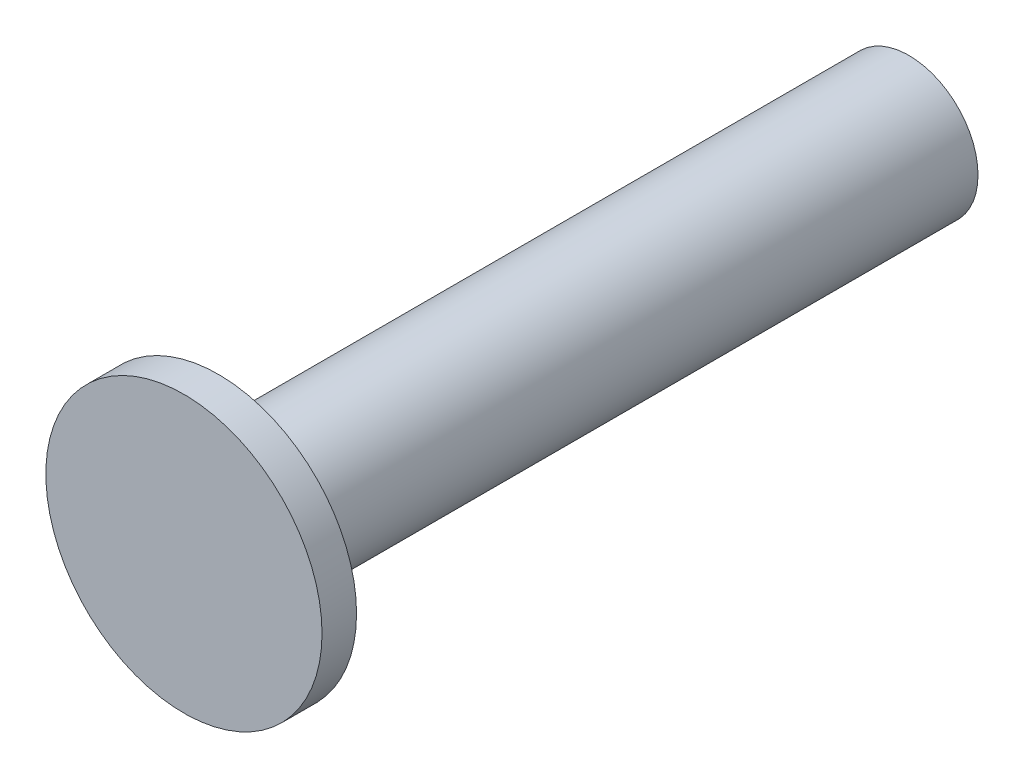
ISO-10303-21;
HEADER;
FILE_DESCRIPTION(('STEP AP214'),'2;1');
FILE_NAME('part.step','',(''),(''),'','','');
FILE_SCHEMA(('AUTOMOTIVE_DESIGN { 1 0 10303 214 1 1 1 1 }'));
ENDSEC;
DATA;
#1=APPLICATION_CONTEXT('core data for automotive mechanical design processes');
#2=APPLICATION_PROTOCOL_DEFINITION('international standard','automotive_design',2000,#1);
#3=PRODUCT_CONTEXT('',#1,'mechanical');
#4=PRODUCT('Part','Part','',(#3));
#5=PRODUCT_RELATED_PRODUCT_CATEGORY('part','',(#4));
#6=PRODUCT_DEFINITION_FORMATION('','',#4);
#7=PRODUCT_DEFINITION_CONTEXT('part definition',#1,'design');
#8=PRODUCT_DEFINITION('design','',#6,#7);
#9=PRODUCT_DEFINITION_SHAPE('','',#8);
#10=(LENGTH_UNIT() NAMED_UNIT(*) SI_UNIT(.MILLI.,.METRE.));
#11=(NAMED_UNIT(*) PLANE_ANGLE_UNIT() SI_UNIT($,.RADIAN.));
#12=(NAMED_UNIT(*) SI_UNIT($,.STERADIAN.) SOLID_ANGLE_UNIT());
#13=UNCERTAINTY_MEASURE_WITH_UNIT(LENGTH_MEASURE(1.E-05),#10,'distance_accuracy_value','');
#14=(GEOMETRIC_REPRESENTATION_CONTEXT(3) GLOBAL_UNCERTAINTY_ASSIGNED_CONTEXT((#13)) GLOBAL_UNIT_ASSIGNED_CONTEXT((#10,
#11,#12)) REPRESENTATION_CONTEXT('',''));
#15=CARTESIAN_POINT('',(0.,0.,0.));
#16=DIRECTION('',(0.,0.,1.));
#17=DIRECTION('',(1.,0.,0.));
#18=AXIS2_PLACEMENT_3D('',#15,#16,#17);
#19=CARTESIAN_POINT('',(0.,0.,20.));
#20=DIRECTION('',(0.,0.,-1.));
#21=DIRECTION('',(-1.,0.,0.));
#22=AXIS2_PLACEMENT_3D('',#19,#20,#21);
#23=CYLINDRICAL_SURFACE('',#22,2.);
#24=CARTESIAN_POINT('',(0.,0.,20.));
#25=DIRECTION('',(0.,0.,1.));
#26=DIRECTION('',(1.,0.,0.));
#27=AXIS2_PLACEMENT_3D('',#24,#25,#26);
#28=CIRCLE('',#27,2.);
#29=CARTESIAN_POINT('',(2.,0.,20.));
#30=VERTEX_POINT('',#29);
#31=EDGE_CURVE('E10',#30,#30,#28,.T.);
#32=ORIENTED_EDGE('',*,*,#31,.F.);
#33=EDGE_LOOP('',(#32));
#34=FACE_BOUND('',#33,.T.);
#35=CARTESIAN_POINT('',(0.,0.,0.));
#36=DIRECTION('',(0.,0.,1.));
#37=DIRECTION('',(1.,0.,0.));
#38=AXIS2_PLACEMENT_3D('',#35,#36,#37);
#39=CIRCLE('',#38,2.);
#40=CARTESIAN_POINT('',(2.,0.,0.));
#41=VERTEX_POINT('',#40);
#42=EDGE_CURVE('E33',#41,#41,#39,.T.);
#43=ORIENTED_EDGE('',*,*,#42,.T.);
#44=EDGE_LOOP('',(#43));
#45=FACE_BOUND('',#44,.T.);
#46=ADVANCED_FACE('F30',(#34,#45),#23,.T.);
#47=CARTESIAN_POINT('',(0.,0.,0.));
#48=DIRECTION('',(0.,0.,1.));
#49=DIRECTION('',(1.,0.,0.));
#50=AXIS2_PLACEMENT_3D('',#47,#48,#49);
#51=PLANE('',#50);
#52=ORIENTED_EDGE('',*,*,#42,.F.);
#53=EDGE_LOOP('',(#52));
#54=FACE_BOUND('',#53,.T.);
#55=ADVANCED_FACE('F53',(#54),#51,.F.);
#56=CARTESIAN_POINT('',(0.,0.,21.));
#57=DIRECTION('',(0.,0.,-1.));
#58=DIRECTION('',(-1.,0.,0.));
#59=AXIS2_PLACEMENT_3D('',#56,#57,#58);
#60=CYLINDRICAL_SURFACE('',#59,4.);
#61=CARTESIAN_POINT('',(0.,0.,21.));
#62=DIRECTION('',(0.,0.,1.));
#63=DIRECTION('',(1.,0.,0.));
#64=AXIS2_PLACEMENT_3D('',#61,#62,#63);
#65=CIRCLE('',#64,4.);
#66=CARTESIAN_POINT('',(4.,0.,21.));
#67=VERTEX_POINT('',#66);
#68=EDGE_CURVE('E40',#67,#67,#65,.T.);
#69=ORIENTED_EDGE('',*,*,#68,.F.);
#70=EDGE_LOOP('',(#69));
#71=FACE_BOUND('',#70,.T.);
#72=CARTESIAN_POINT('',(0.,0.,20.));
#73=DIRECTION('',(0.,0.,1.));
#74=DIRECTION('',(1.,0.,0.));
#75=AXIS2_PLACEMENT_3D('',#72,#73,#74);
#76=CIRCLE('',#75,4.);
#77=CARTESIAN_POINT('',(4.,0.,20.));
#78=VERTEX_POINT('',#77);
#79=EDGE_CURVE('E42',#78,#78,#76,.T.);
#80=ORIENTED_EDGE('',*,*,#79,.T.);
#81=EDGE_LOOP('',(#80));
#82=FACE_BOUND('',#81,.T.);
#83=ADVANCED_FACE('F50',(#71,#82),#60,.T.);
#84=CARTESIAN_POINT('',(0.,0.,21.));
#85=DIRECTION('',(0.,0.,1.));
#86=DIRECTION('',(1.,0.,0.));
#87=AXIS2_PLACEMENT_3D('',#84,#85,#86);
#88=PLANE('',#87);
#89=ORIENTED_EDGE('',*,*,#68,.T.);
#90=EDGE_LOOP('',(#89));
#91=FACE_BOUND('',#90,.T.);
#92=ADVANCED_FACE('F48',(#91),#88,.T.);
#93=CARTESIAN_POINT('',(0.,0.,20.));
#94=DIRECTION('',(0.,0.,1.));
#95=DIRECTION('',(1.,0.,0.));
#96=AXIS2_PLACEMENT_3D('',#93,#94,#95);
#97=PLANE('',#96);
#98=ORIENTED_EDGE('',*,*,#31,.T.);
#99=EDGE_LOOP('',(#98));
#100=FACE_BOUND('',#99,.T.);
#101=ORIENTED_EDGE('',*,*,#79,.F.);
#102=EDGE_LOOP('',(#101));
#103=FACE_BOUND('',#102,.T.);
#104=ADVANCED_FACE('F57',(#100,#103),#97,.F.);
#105=CLOSED_SHELL('',(#46,#55,#83,#92,#104));
#106=MANIFOLD_SOLID_BREP('B2',#105);
#107=ADVANCED_BREP_SHAPE_REPRESENTATION('',(#18,#106),#14);
#108=SHAPE_DEFINITION_REPRESENTATION(#9,#107);
ENDSEC;
END-ISO-10303-21;
